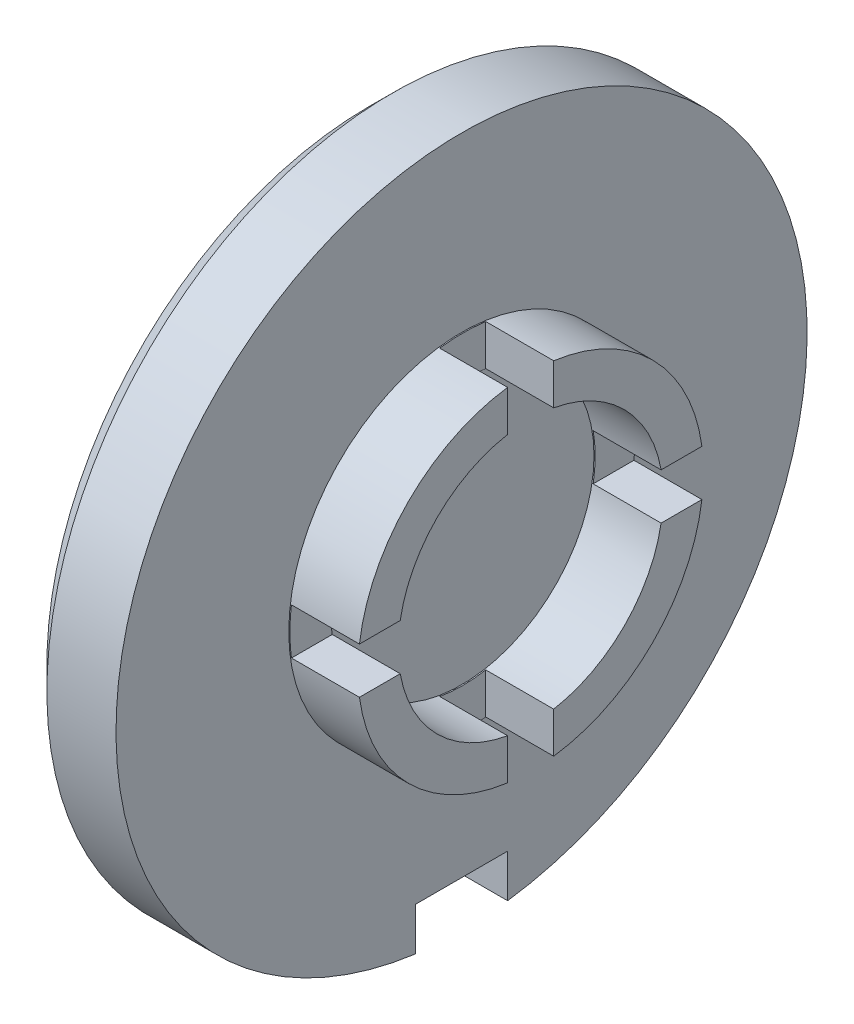
ISO-10303-21;
HEADER;
FILE_DESCRIPTION(('STEP AP214'),'2;1');
FILE_NAME('part.step','',(''),(''),'','','');
FILE_SCHEMA(('AUTOMOTIVE_DESIGN { 1 0 10303 214 1 1 1 1 }'));
ENDSEC;
DATA;
#1=APPLICATION_CONTEXT('core data for automotive mechanical design processes');
#2=APPLICATION_PROTOCOL_DEFINITION('international standard','automotive_design',2000,#1);
#3=PRODUCT_CONTEXT('',#1,'mechanical');
#4=PRODUCT('Part','Part','',(#3));
#5=PRODUCT_RELATED_PRODUCT_CATEGORY('part','',(#4));
#6=PRODUCT_DEFINITION_FORMATION('','',#4);
#7=PRODUCT_DEFINITION_CONTEXT('part definition',#1,'design');
#8=PRODUCT_DEFINITION('design','',#6,#7);
#9=PRODUCT_DEFINITION_SHAPE('','',#8);
#10=(LENGTH_UNIT() NAMED_UNIT(*) SI_UNIT(.MILLI.,.METRE.));
#11=(NAMED_UNIT(*) PLANE_ANGLE_UNIT() SI_UNIT($,.RADIAN.));
#12=(NAMED_UNIT(*) SI_UNIT($,.STERADIAN.) SOLID_ANGLE_UNIT());
#13=UNCERTAINTY_MEASURE_WITH_UNIT(LENGTH_MEASURE(1.E-05),#10,'distance_accuracy_value','');
#14=(GEOMETRIC_REPRESENTATION_CONTEXT(3) GLOBAL_UNCERTAINTY_ASSIGNED_CONTEXT((#13)) GLOBAL_UNIT_ASSIGNED_CONTEXT((#10,
#11,#12)) REPRESENTATION_CONTEXT('',''));
#15=CARTESIAN_POINT('',(0.,0.,0.));
#16=DIRECTION('',(0.,0.,1.));
#17=DIRECTION('',(1.,0.,0.));
#18=AXIS2_PLACEMENT_3D('',#15,#16,#17);
#19=CARTESIAN_POINT('',(-61.,18.,-52.));
#20=DIRECTION('',(1.,0.,0.));
#21=DIRECTION('',(0.,0.,-1.));
#22=AXIS2_PLACEMENT_3D('',#19,#20,#21);
#23=PLANE('',#22);
#24=DIRECTION('',(0.,1.,0.));
#25=VECTOR('',#24,1.);
#26=CARTESIAN_POINT('',(-61.,18.,-51.2));
#27=LINE('',#26,#25);
#28=CARTESIAN_POINT('',(-61.,12.4574374157796,-51.2));
#29=VERTEX_POINT('',#28);
#30=CARTESIAN_POINT('',(-61.,12.8,-51.2));
#31=VERTEX_POINT('',#30);
#32=EDGE_CURVE('E359',#29,#31,#27,.T.);
#33=ORIENTED_EDGE('',*,*,#32,.F.);
#34=CARTESIAN_POINT('',(-61.,18.,-52.));
#35=DIRECTION('',(-1.,0.,0.));
#36=DIRECTION('',(0.,0.,1.));
#37=AXIS2_PLACEMENT_3D('',#34,#35,#36);
#38=CIRCLE('',#37,5.6);
#39=CARTESIAN_POINT('',(-61.,12.4574374157796,-52.8));
#40=VERTEX_POINT('',#39);
#41=EDGE_CURVE('E260',#29,#40,#38,.T.);
#42=ORIENTED_EDGE('',*,*,#41,.T.);
#43=DIRECTION('',(0.,1.,0.));
#44=VECTOR('',#43,1.);
#45=CARTESIAN_POINT('',(-61.,18.,-52.8));
#46=LINE('',#45,#44);
#47=CARTESIAN_POINT('',(-61.,12.8,-52.8));
#48=VERTEX_POINT('',#47);
#49=EDGE_CURVE('E395',#40,#48,#46,.T.);
#50=ORIENTED_EDGE('',*,*,#49,.T.);
#51=DIRECTION('',(0.,0.,-1.));
#52=VECTOR('',#51,1.);
#53=CARTESIAN_POINT('',(-61.,12.8,-52.));
#54=LINE('',#53,#52);
#55=EDGE_CURVE('E205',#31,#48,#54,.T.);
#56=ORIENTED_EDGE('',*,*,#55,.F.);
#57=EDGE_LOOP('',(#33,#42,#50,#56));
#58=FACE_BOUND('',#57,.T.);
#59=ADVANCED_FACE('F47',(#58),#23,.F.);
#60=CARTESIAN_POINT('',(-60.6,18.,-52.));
#61=DIRECTION('',(1.,0.,0.));
#62=DIRECTION('',(0.,0.,-1.));
#63=AXIS2_PLACEMENT_3D('',#60,#61,#62);
#64=CONICAL_SURFACE('',#63,6.,0.785398163397448);
#65=CARTESIAN_POINT('',(-59.7053728090001,11.151943041791,-51.2));
#66=CARTESIAN_POINT('',(-59.8881030317565,11.3359192533132,-51.2));
#67=CARTESIAN_POINT('',(-60.0707866928955,11.5199417495671,-51.2));
#68=CARTESIAN_POINT('',(-60.4360245862569,11.8881147982359,-51.2));
#69=CARTESIAN_POINT('',(-60.6185788185969,12.0722653505341,-51.2));
#70=CARTESIAN_POINT('',(-60.9835219670776,12.4407304192213,-51.2));
#71=CARTESIAN_POINT('',(-61.1659108831408,12.625044935687,-51.2));
#72=CARTESIAN_POINT('',(-61.5304582431577,12.9939020574378,-51.2));
#73=CARTESIAN_POINT('',(-61.7126166868986,13.1784446629332,-51.2));
#74=CARTESIAN_POINT('',(-61.8946271909999,13.3631332484449,-51.2));
#75=B_SPLINE_CURVE_WITH_KNOTS('',3,(#65,#66,#67,#68,#69,#70,#71,#72,#73,#74),.UNSPECIFIED.,.F.,
.F.,(4,2,2,2,4),(0.,0.777906337908816,1.55581196755151,2.33371796179649,3.11162467374071),.UNSPECIFIED.);
#76=CARTESIAN_POINT('',(-60.6,12.0535725010726,-51.2));
#77=VERTEX_POINT('',#76);
#78=EDGE_CURVE('E362',#77,#29,#75,.T.);
#79=ORIENTED_EDGE('',*,*,#78,.F.);
#80=CARTESIAN_POINT('',(-60.6,18.,-52.));
#81=DIRECTION('',(-1.,0.,0.));
#82=DIRECTION('',(0.,0.,1.));
#83=AXIS2_PLACEMENT_3D('',#80,#81,#82);
#84=CIRCLE('',#83,6.);
#85=CARTESIAN_POINT('',(-60.6,12.0535725010726,-52.8));
#86=VERTEX_POINT('',#85);
#87=EDGE_CURVE('E264',#77,#86,#84,.T.);
#88=ORIENTED_EDGE('',*,*,#87,.T.);
#89=CARTESIAN_POINT('',(-59.7053728090001,11.151943041791,-52.8));
#90=CARTESIAN_POINT('',(-59.8881030317565,11.3359192533132,-52.8));
#91=CARTESIAN_POINT('',(-60.0707866928955,11.5199417495671,-52.8));
#92=CARTESIAN_POINT('',(-60.4360245862569,11.8881147982359,-52.8));
#93=CARTESIAN_POINT('',(-60.6185788185969,12.0722653505341,-52.8));
#94=CARTESIAN_POINT('',(-60.9835219670776,12.4407304192213,-52.8));
#95=CARTESIAN_POINT('',(-61.1659108831408,12.625044935687,-52.8));
#96=CARTESIAN_POINT('',(-61.5304582431577,12.9939020574378,-52.8));
#97=CARTESIAN_POINT('',(-61.7126166868986,13.1784446629332,-52.8));
#98=CARTESIAN_POINT('',(-61.8946271909999,13.3631332484449,-52.8));
#99=B_SPLINE_CURVE_WITH_KNOTS('',3,(#89,#90,#91,#92,#93,#94,#95,#96,#97,#98),.UNSPECIFIED.,.F.,
.F.,(4,2,2,2,4),(0.,0.777906337908816,1.55581196755151,2.33371796179649,3.11162467374071),.UNSPECIFIED.);
#100=EDGE_CURVE('E387',#86,#40,#99,.T.);
#101=ORIENTED_EDGE('',*,*,#100,.T.);
#102=ORIENTED_EDGE('',*,*,#41,.F.);
#103=EDGE_LOOP('',(#79,#88,#101,#102));
#104=FACE_BOUND('',#103,.T.);
#105=ADVANCED_FACE('F373',(#104),#64,.T.);
#106=CARTESIAN_POINT('',(-66.,18.,-52.));
#107=DIRECTION('',(-1.,0.,0.));
#108=DIRECTION('',(0.,0.,1.));
#109=AXIS2_PLACEMENT_3D('',#106,#107,#108);
#110=CYLINDRICAL_SURFACE('',#109,6.);
#111=DIRECTION('',(-1.,0.,0.));
#112=VECTOR('',#111,1.);
#113=CARTESIAN_POINT('',(-66.,12.0535725010726,-51.2));
#114=LINE('',#113,#112);
#115=CARTESIAN_POINT('',(-59.4,12.0535725010726,-51.2));
#116=VERTEX_POINT('',#115);
#117=EDGE_CURVE('E371',#116,#77,#114,.T.);
#118=ORIENTED_EDGE('',*,*,#117,.F.);
#119=CARTESIAN_POINT('',(-59.4,18.,-52.));
#120=DIRECTION('',(-1.,0.,0.));
#121=DIRECTION('',(0.,0.,1.));
#122=AXIS2_PLACEMENT_3D('',#119,#120,#121);
#123=CIRCLE('',#122,6.);
#124=CARTESIAN_POINT('',(-59.4,12.0535725010726,-52.8));
#125=VERTEX_POINT('',#124);
#126=EDGE_CURVE('E268',#116,#125,#123,.T.);
#127=ORIENTED_EDGE('',*,*,#126,.T.);
#128=DIRECTION('',(-1.,0.,0.));
#129=VECTOR('',#128,1.);
#130=CARTESIAN_POINT('',(-66.,12.0535725010726,-52.8));
#131=LINE('',#130,#129);
#132=EDGE_CURVE('E63',#125,#86,#131,.T.);
#133=ORIENTED_EDGE('',*,*,#132,.T.);
#134=ORIENTED_EDGE('',*,*,#87,.F.);
#135=EDGE_LOOP('',(#118,#127,#133,#134));
#136=FACE_BOUND('',#135,.T.);
#137=ADVANCED_FACE('F406',(#136),#110,.T.);
#138=CARTESIAN_POINT('',(-59.4,24.,-52.));
#139=DIRECTION('',(-1.,0.,0.));
#140=DIRECTION('',(0.,0.,1.));
#141=AXIS2_PLACEMENT_3D('',#138,#139,#140);
#142=PLANE('',#141);
#143=CARTESIAN_POINT('',(-59.4,18.,-52.));
#144=DIRECTION('',(-1.,0.,0.));
#145=DIRECTION('',(0.,0.,1.));
#146=AXIS2_PLACEMENT_3D('',#143,#144,#145);
#147=CIRCLE('',#146,3.);
#148=CARTESIAN_POINT('',(-59.4,18.,-49.));
#149=VERTEX_POINT('',#148);
#150=EDGE_CURVE('E271',#149,#149,#147,.T.);
#151=ORIENTED_EDGE('',*,*,#150,.T.);
#152=EDGE_LOOP('',(#151));
#153=FACE_BOUND('',#152,.T.);
#154=DIRECTION('',(0.,-1.,0.));
#155=VECTOR('',#154,1.);
#156=CARTESIAN_POINT('',(-59.4,24.,-51.2));
#157=LINE('',#156,#155);
#158=CARTESIAN_POINT('',(-59.4,12.8,-51.2));
#159=VERTEX_POINT('',#158);
#160=EDGE_CURVE('E11',#159,#116,#157,.T.);
#161=ORIENTED_EDGE('',*,*,#160,.F.);
#162=DIRECTION('',(0.,0.,1.));
#163=VECTOR('',#162,1.);
#164=CARTESIAN_POINT('',(-59.4,12.8,-52.));
#165=LINE('',#164,#163);
#166=CARTESIAN_POINT('',(-59.4,12.8,-52.8));
#167=VERTEX_POINT('',#166);
#168=EDGE_CURVE('E56',#167,#159,#165,.T.);
#169=ORIENTED_EDGE('',*,*,#168,.F.);
#170=DIRECTION('',(0.,-1.,0.));
#171=VECTOR('',#170,1.);
#172=CARTESIAN_POINT('',(-59.4,24.,-52.8));
#173=LINE('',#172,#171);
#174=EDGE_CURVE('E188',#167,#125,#173,.T.);
#175=ORIENTED_EDGE('',*,*,#174,.T.);
#176=ORIENTED_EDGE('',*,*,#126,.F.);
#177=EDGE_LOOP('',(#161,#169,#175,#176));
#178=FACE_BOUND('',#177,.T.);
#179=ADVANCED_FACE('F210',(#153,#178),#142,.F.);
#180=CARTESIAN_POINT('',(-58.2,21.,-52.));
#181=DIRECTION('',(-1.,0.,0.));
#182=DIRECTION('',(0.,0.,1.));
#183=AXIS2_PLACEMENT_3D('',#180,#181,#182);
#184=PLANE('',#183);
#185=DIRECTION('',(0.,-1.,0.));
#186=VECTOR('',#185,1.);
#187=CARTESIAN_POINT('',(-58.2,21.,-51.6));
#188=LINE('',#187,#186);
#189=CARTESIAN_POINT('',(-58.2,15.7350496694188,-51.6));
#190=VERTEX_POINT('',#189);
#191=CARTESIAN_POINT('',(-58.2,15.0267862505363,-51.6));
#192=VERTEX_POINT('',#191);
#193=EDGE_CURVE('E324',#190,#192,#188,.T.);
#194=ORIENTED_EDGE('',*,*,#193,.F.);
#195=CARTESIAN_POINT('',(-58.2,18.,-52.));
#196=DIRECTION('',(-1.,0.,0.));
#197=DIRECTION('',(0.,0.,1.));
#198=AXIS2_PLACEMENT_3D('',#195,#196,#197);
#199=CIRCLE('',#198,2.3);
#200=CARTESIAN_POINT('',(-58.2,17.6,-49.7350496694188));
#201=VERTEX_POINT('',#200);
#202=EDGE_CURVE('E259',#190,#201,#199,.T.);
#203=ORIENTED_EDGE('',*,*,#202,.T.);
#204=DIRECTION('',(0.,0.,-1.));
#205=VECTOR('',#204,1.);
#206=CARTESIAN_POINT('',(-58.2,17.6,-52.));
#207=LINE('',#206,#205);
#208=CARTESIAN_POINT('',(-58.2,17.6,-49.0267862505363));
#209=VERTEX_POINT('',#208);
#210=EDGE_CURVE('E293',#209,#201,#207,.T.);
#211=ORIENTED_EDGE('',*,*,#210,.F.);
#212=CARTESIAN_POINT('',(-58.2,18.,-52.));
#213=DIRECTION('',(-1.,0.,0.));
#214=DIRECTION('',(0.,0.,1.));
#215=AXIS2_PLACEMENT_3D('',#212,#213,#214);
#216=CIRCLE('',#215,3.);
#217=EDGE_CURVE('E280',#192,#209,#216,.T.);
#218=ORIENTED_EDGE('',*,*,#217,.F.);
#219=EDGE_LOOP('',(#194,#203,#211,#218));
#220=FACE_BOUND('',#219,.T.);
#221=ADVANCED_FACE('F431',(#220),#184,.F.);
#222=DIRECTION('',(0.,-1.,0.));
#223=VECTOR('',#222,1.);
#224=CARTESIAN_POINT('',(-58.2,21.,-51.6));
#225=LINE('',#224,#223);
#226=CARTESIAN_POINT('',(-58.2,20.9732137494637,-51.6));
#227=VERTEX_POINT('',#226);
#228=CARTESIAN_POINT('',(-58.2,20.2649503305812,-51.6));
#229=VERTEX_POINT('',#228);
#230=EDGE_CURVE('E330',#227,#229,#225,.T.);
#231=ORIENTED_EDGE('',*,*,#230,.F.);
#232=CARTESIAN_POINT('',(-58.2,18.4,-49.0267862505363));
#233=VERTEX_POINT('',#232);
#234=EDGE_CURVE('E275',#233,#227,#216,.T.);
#235=ORIENTED_EDGE('',*,*,#234,.F.);
#236=DIRECTION('',(0.,0.,1.));
#237=VECTOR('',#236,1.);
#238=CARTESIAN_POINT('',(-58.2,18.4,-52.));
#239=LINE('',#238,#237);
#240=CARTESIAN_POINT('',(-58.2,18.4,-49.7350496694188));
#241=VERTEX_POINT('',#240);
#242=EDGE_CURVE('E300',#241,#233,#239,.T.);
#243=ORIENTED_EDGE('',*,*,#242,.F.);
#244=EDGE_CURVE('E249',#241,#229,#199,.T.);
#245=ORIENTED_EDGE('',*,*,#244,.T.);
#246=EDGE_LOOP('',(#231,#235,#243,#245));
#247=FACE_BOUND('',#246,.T.);
#248=ADVANCED_FACE('F423',(#247),#184,.F.);
#249=CARTESIAN_POINT('',(-66.,18.,-52.));
#250=DIRECTION('',(-1.,0.,0.));
#251=DIRECTION('',(0.,0.,1.));
#252=AXIS2_PLACEMENT_3D('',#249,#250,#251);
#253=CYLINDRICAL_SURFACE('',#252,2.3);
#254=CARTESIAN_POINT('',(-59.4,18.,-52.));
#255=DIRECTION('',(-1.,0.,0.));
#256=DIRECTION('',(0.,0.,1.));
#257=AXIS2_PLACEMENT_3D('',#254,#255,#256);
#258=CIRCLE('',#257,2.3);
#259=CARTESIAN_POINT('',(-59.4,18.,-49.7));
#260=VERTEX_POINT('',#259);
#261=EDGE_CURVE('E255',#260,#260,#258,.T.);
#262=ORIENTED_EDGE('',*,*,#261,.T.);
#263=EDGE_LOOP('',(#262));
#264=FACE_BOUND('',#263,.T.);
#265=DIRECTION('',(-1.,0.,0.));
#266=VECTOR('',#265,1.);
#267=CARTESIAN_POINT('',(-66.,15.7350496694188,-51.6));
#268=LINE('',#267,#266);
#269=CARTESIAN_POINT('',(-59.38,15.7350496694188,-51.6));
#270=VERTEX_POINT('',#269);
#271=EDGE_CURVE('E321',#270,#190,#268,.F.);
#272=ORIENTED_EDGE('',*,*,#271,.F.);
#273=CARTESIAN_POINT('',(-59.38,18.,-52.));
#274=DIRECTION('',(1.,0.,0.));
#275=DIRECTION('',(0.,0.,-1.));
#276=AXIS2_PLACEMENT_3D('',#273,#274,#275);
#277=CIRCLE('',#276,2.3);
#278=CARTESIAN_POINT('',(-59.38,15.7350496694188,-52.4));
#279=VERTEX_POINT('',#278);
#280=EDGE_CURVE('E317',#279,#270,#277,.F.);
#281=ORIENTED_EDGE('',*,*,#280,.F.);
#282=DIRECTION('',(-1.,0.,0.));
#283=VECTOR('',#282,1.);
#284=CARTESIAN_POINT('',(-66.,15.7350496694188,-52.4));
#285=LINE('',#284,#283);
#286=CARTESIAN_POINT('',(-58.2,15.7350496694188,-52.4));
#287=VERTEX_POINT('',#286);
#288=EDGE_CURVE('E333',#279,#287,#285,.F.);
#289=ORIENTED_EDGE('',*,*,#288,.T.);
#290=CARTESIAN_POINT('',(-58.2,17.6,-54.2649503305812));
#291=VERTEX_POINT('',#290);
#292=EDGE_CURVE('E254',#291,#287,#199,.T.);
#293=ORIENTED_EDGE('',*,*,#292,.F.);
#294=DIRECTION('',(-1.,0.,0.));
#295=VECTOR('',#294,1.);
#296=CARTESIAN_POINT('',(-66.,17.6,-54.2649503305812));
#297=LINE('',#296,#295);
#298=CARTESIAN_POINT('',(-59.38,17.6,-54.2649503305812));
#299=VERTEX_POINT('',#298);
#300=EDGE_CURVE('E286',#299,#291,#297,.F.);
#301=ORIENTED_EDGE('',*,*,#300,.F.);
#302=CARTESIAN_POINT('',(-59.38,18.,-52.));
#303=DIRECTION('',(1.,0.,0.));
#304=DIRECTION('',(0.,0.,-1.));
#305=AXIS2_PLACEMENT_3D('',#302,#303,#304);
#306=CIRCLE('',#305,2.3);
#307=CARTESIAN_POINT('',(-59.38,18.4,-54.2649503305812));
#308=VERTEX_POINT('',#307);
#309=EDGE_CURVE('E282',#308,#299,#306,.F.);
#310=ORIENTED_EDGE('',*,*,#309,.F.);
#311=DIRECTION('',(-1.,0.,0.));
#312=VECTOR('',#311,1.);
#313=CARTESIAN_POINT('',(-66.,18.4,-54.2649503305812));
#314=LINE('',#313,#312);
#315=CARTESIAN_POINT('',(-58.2,18.4,-54.2649503305812));
#316=VERTEX_POINT('',#315);
#317=EDGE_CURVE('E301',#316,#308,#314,.T.);
#318=ORIENTED_EDGE('',*,*,#317,.F.);
#319=CARTESIAN_POINT('',(-58.2,20.2649503305812,-52.4));
#320=VERTEX_POINT('',#319);
#321=EDGE_CURVE('E253',#320,#316,#199,.T.);
#322=ORIENTED_EDGE('',*,*,#321,.F.);
#323=DIRECTION('',(-1.,0.,0.));
#324=VECTOR('',#323,1.);
#325=CARTESIAN_POINT('',(-66.,20.2649503305812,-52.4));
#326=LINE('',#325,#324);
#327=CARTESIAN_POINT('',(-59.38,20.2649503305812,-52.4));
#328=VERTEX_POINT('',#327);
#329=EDGE_CURVE('E341',#320,#328,#326,.T.);
#330=ORIENTED_EDGE('',*,*,#329,.T.);
#331=CARTESIAN_POINT('',(-59.38,20.2649503305812,-51.6));
#332=VERTEX_POINT('',#331);
#333=EDGE_CURVE('E318',#332,#328,#277,.F.);
#334=ORIENTED_EDGE('',*,*,#333,.F.);
#335=DIRECTION('',(-1.,0.,0.));
#336=VECTOR('',#335,1.);
#337=CARTESIAN_POINT('',(-66.,20.2649503305812,-51.6));
#338=LINE('',#337,#336);
#339=EDGE_CURVE('E327',#229,#332,#338,.T.);
#340=ORIENTED_EDGE('',*,*,#339,.F.);
#341=ORIENTED_EDGE('',*,*,#244,.F.);
#342=DIRECTION('',(-1.,0.,0.));
#343=VECTOR('',#342,1.);
#344=CARTESIAN_POINT('',(-66.,18.4,-49.7350496694188));
#345=LINE('',#344,#343);
#346=CARTESIAN_POINT('',(-59.38,18.4,-49.7350496694188));
#347=VERTEX_POINT('',#346);
#348=EDGE_CURVE('E297',#347,#241,#345,.F.);
#349=ORIENTED_EDGE('',*,*,#348,.F.);
#350=CARTESIAN_POINT('',(-59.38,17.6,-49.7350496694188));
#351=VERTEX_POINT('',#350);
#352=EDGE_CURVE('E285',#351,#347,#306,.F.);
#353=ORIENTED_EDGE('',*,*,#352,.F.);
#354=DIRECTION('',(-1.,0.,0.));
#355=VECTOR('',#354,1.);
#356=CARTESIAN_POINT('',(-66.,17.6,-49.7350496694188));
#357=LINE('',#356,#355);
#358=EDGE_CURVE('E290',#201,#351,#357,.T.);
#359=ORIENTED_EDGE('',*,*,#358,.F.);
#360=ORIENTED_EDGE('',*,*,#202,.F.);
#361=EDGE_LOOP('',(#272,#281,#289,#293,#301,#310,#318,#322,#330,#334,#340,#341,#349,#353,#359,#360));
#362=FACE_BOUND('',#361,.T.);
#363=ADVANCED_FACE('F420',(#264,#362),#253,.F.);
#364=CARTESIAN_POINT('',(-66.,18.,-52.));
#365=DIRECTION('',(-1.,0.,0.));
#366=DIRECTION('',(0.,0.,1.));
#367=AXIS2_PLACEMENT_3D('',#364,#365,#366);
#368=CYLINDRICAL_SURFACE('',#367,3.);
#369=ORIENTED_EDGE('',*,*,#150,.F.);
#370=EDGE_LOOP('',(#369));
#371=FACE_BOUND('',#370,.T.);
#372=DIRECTION('',(-1.,0.,0.));
#373=VECTOR('',#372,1.);
#374=CARTESIAN_POINT('',(-66.,15.0267862505363,-51.6));
#375=LINE('',#374,#373);
#376=CARTESIAN_POINT('',(-59.38,15.0267862505363,-51.6));
#377=VERTEX_POINT('',#376);
#378=EDGE_CURVE('E198',#192,#377,#375,.T.);
#379=ORIENTED_EDGE('',*,*,#378,.F.);
#380=ORIENTED_EDGE('',*,*,#217,.T.);
#381=DIRECTION('',(-1.,0.,0.));
#382=VECTOR('',#381,1.);
#383=CARTESIAN_POINT('',(-66.,17.6,-49.0267862505363));
#384=LINE('',#383,#382);
#385=CARTESIAN_POINT('',(-59.38,17.6,-49.0267862505363));
#386=VERTEX_POINT('',#385);
#387=EDGE_CURVE('E230',#386,#209,#384,.F.);
#388=ORIENTED_EDGE('',*,*,#387,.F.);
#389=CARTESIAN_POINT('',(-59.38,18.,-52.));
#390=DIRECTION('',(1.,0.,0.));
#391=DIRECTION('',(0.,0.,-1.));
#392=AXIS2_PLACEMENT_3D('',#389,#390,#391);
#393=CIRCLE('',#392,3.);
#394=CARTESIAN_POINT('',(-59.38,18.4,-49.0267862505363));
#395=VERTEX_POINT('',#394);
#396=EDGE_CURVE('E234',#395,#386,#393,.T.);
#397=ORIENTED_EDGE('',*,*,#396,.F.);
#398=DIRECTION('',(-1.,0.,0.));
#399=VECTOR('',#398,1.);
#400=CARTESIAN_POINT('',(-66.,18.4,-49.0267862505363));
#401=LINE('',#400,#399);
#402=EDGE_CURVE('E235',#233,#395,#401,.T.);
#403=ORIENTED_EDGE('',*,*,#402,.F.);
#404=ORIENTED_EDGE('',*,*,#234,.T.);
#405=DIRECTION('',(-1.,0.,0.));
#406=VECTOR('',#405,1.);
#407=CARTESIAN_POINT('',(-66.,20.9732137494637,-51.6));
#408=LINE('',#407,#406);
#409=CARTESIAN_POINT('',(-59.38,20.9732137494637,-51.6));
#410=VERTEX_POINT('',#409);
#411=EDGE_CURVE('E220',#410,#227,#408,.F.);
#412=ORIENTED_EDGE('',*,*,#411,.F.);
#413=CARTESIAN_POINT('',(-59.38,18.,-52.));
#414=DIRECTION('',(1.,0.,0.));
#415=DIRECTION('',(0.,0.,-1.));
#416=AXIS2_PLACEMENT_3D('',#413,#414,#415);
#417=CIRCLE('',#416,3.);
#418=CARTESIAN_POINT('',(-59.38,20.9732137494637,-52.4));
#419=VERTEX_POINT('',#418);
#420=EDGE_CURVE('E223',#419,#410,#417,.T.);
#421=ORIENTED_EDGE('',*,*,#420,.F.);
#422=DIRECTION('',(-1.,0.,0.));
#423=VECTOR('',#422,1.);
#424=CARTESIAN_POINT('',(-66.,20.9732137494637,-52.4));
#425=LINE('',#424,#423);
#426=CARTESIAN_POINT('',(-58.2,20.9732137494637,-52.4));
#427=VERTEX_POINT('',#426);
#428=EDGE_CURVE('E226',#419,#427,#425,.F.);
#429=ORIENTED_EDGE('',*,*,#428,.T.);
#430=CARTESIAN_POINT('',(-58.2,18.4,-54.9732137494637));
#431=VERTEX_POINT('',#430);
#432=EDGE_CURVE('E279',#427,#431,#216,.T.);
#433=ORIENTED_EDGE('',*,*,#432,.T.);
#434=DIRECTION('',(-1.,0.,0.));
#435=VECTOR('',#434,1.);
#436=CARTESIAN_POINT('',(-66.,18.4,-54.9732137494637));
#437=LINE('',#436,#435);
#438=CARTESIAN_POINT('',(-59.38,18.4,-54.9732137494637));
#439=VERTEX_POINT('',#438);
#440=EDGE_CURVE('E245',#439,#431,#437,.F.);
#441=ORIENTED_EDGE('',*,*,#440,.F.);
#442=CARTESIAN_POINT('',(-59.38,17.6,-54.9732137494637));
#443=VERTEX_POINT('',#442);
#444=EDGE_CURVE('E241',#443,#439,#393,.T.);
#445=ORIENTED_EDGE('',*,*,#444,.F.);
#446=DIRECTION('',(-1.,0.,0.));
#447=VECTOR('',#446,1.);
#448=CARTESIAN_POINT('',(-66.,17.6,-54.9732137494637));
#449=LINE('',#448,#447);
#450=CARTESIAN_POINT('',(-58.2,17.6,-54.9732137494637));
#451=VERTEX_POINT('',#450);
#452=EDGE_CURVE('E238',#451,#443,#449,.T.);
#453=ORIENTED_EDGE('',*,*,#452,.F.);
#454=CARTESIAN_POINT('',(-58.2,15.0267862505363,-52.4));
#455=VERTEX_POINT('',#454);
#456=EDGE_CURVE('E281',#451,#455,#216,.T.);
#457=ORIENTED_EDGE('',*,*,#456,.T.);
#458=DIRECTION('',(-1.,0.,0.));
#459=VECTOR('',#458,1.);
#460=CARTESIAN_POINT('',(-66.,15.0267862505363,-52.4));
#461=LINE('',#460,#459);
#462=CARTESIAN_POINT('',(-59.38,15.0267862505363,-52.4));
#463=VERTEX_POINT('',#462);
#464=EDGE_CURVE('E216',#455,#463,#461,.T.);
#465=ORIENTED_EDGE('',*,*,#464,.T.);
#466=EDGE_CURVE('E215',#377,#463,#417,.T.);
#467=ORIENTED_EDGE('',*,*,#466,.F.);
#468=EDGE_LOOP('',(#379,#380,#388,#397,#403,#404,#412,#421,#429,#433,#441,#445,#453,#457,#465,#467));
#469=FACE_BOUND('',#468,.T.);
#470=ADVANCED_FACE('F422',(#371,#469),#368,.T.);
#471=ORIENTED_EDGE('',*,*,#292,.T.);
#472=DIRECTION('',(0.,-1.,0.));
#473=VECTOR('',#472,1.);
#474=CARTESIAN_POINT('',(-58.2,21.,-52.4));
#475=LINE('',#474,#473);
#476=EDGE_CURVE('E337',#287,#455,#475,.T.);
#477=ORIENTED_EDGE('',*,*,#476,.T.);
#478=ORIENTED_EDGE('',*,*,#456,.F.);
#479=EDGE_CURVE('E289',#291,#451,#207,.T.);
#480=ORIENTED_EDGE('',*,*,#479,.F.);
#481=EDGE_LOOP('',(#471,#477,#478,#480));
#482=FACE_BOUND('',#481,.T.);
#483=ADVANCED_FACE('F49',(#482),#184,.F.);
#484=ORIENTED_EDGE('',*,*,#432,.F.);
#485=DIRECTION('',(0.,-1.,0.));
#486=VECTOR('',#485,1.);
#487=CARTESIAN_POINT('',(-58.2,21.,-52.4));
#488=LINE('',#487,#486);
#489=EDGE_CURVE('E345',#427,#320,#488,.T.);
#490=ORIENTED_EDGE('',*,*,#489,.T.);
#491=ORIENTED_EDGE('',*,*,#321,.T.);
#492=EDGE_CURVE('E304',#431,#316,#239,.T.);
#493=ORIENTED_EDGE('',*,*,#492,.F.);
#494=EDGE_LOOP('',(#484,#490,#491,#493));
#495=FACE_BOUND('',#494,.T.);
#496=ADVANCED_FACE('F418',(#495),#184,.F.);
#497=CARTESIAN_POINT('',(-59.4,20.3,-52.));
#498=DIRECTION('',(-1.,0.,0.));
#499=DIRECTION('',(0.,0.,1.));
#500=AXIS2_PLACEMENT_3D('',#497,#498,#499);
#501=PLANE('',#500);
#502=ORIENTED_EDGE('',*,*,#261,.F.);
#503=EDGE_LOOP('',(#502));
#504=FACE_BOUND('',#503,.T.);
#505=ADVANCED_FACE('F415',(#504),#501,.F.);
#506=CARTESIAN_POINT('',(-59.38,17.6,-48.8));
#507=DIRECTION('',(0.,1.,0.));
#508=DIRECTION('',(0.,0.,1.));
#509=AXIS2_PLACEMENT_3D('',#506,#507,#508);
#510=PLANE('',#509);
#511=ORIENTED_EDGE('',*,*,#300,.T.);
#512=ORIENTED_EDGE('',*,*,#479,.T.);
#513=ORIENTED_EDGE('',*,*,#452,.T.);
#514=DIRECTION('',(0.,0.,-1.));
#515=VECTOR('',#514,1.);
#516=CARTESIAN_POINT('',(-59.38,17.6,-48.8));
#517=LINE('',#516,#515);
#518=EDGE_CURVE('E309',#299,#443,#517,.T.);
#519=ORIENTED_EDGE('',*,*,#518,.F.);
#520=EDGE_LOOP('',(#511,#512,#513,#519));
#521=FACE_BOUND('',#520,.T.);
#522=ADVANCED_FACE('F417',(#521),#510,.T.);
#523=CARTESIAN_POINT('',(-59.38,18.4,-48.8));
#524=DIRECTION('',(0.,-1.,0.));
#525=DIRECTION('',(0.,0.,-1.));
#526=AXIS2_PLACEMENT_3D('',#523,#524,#525);
#527=PLANE('',#526);
#528=ORIENTED_EDGE('',*,*,#317,.T.);
#529=DIRECTION('',(0.,0.,-1.));
#530=VECTOR('',#529,1.);
#531=CARTESIAN_POINT('',(-59.38,18.4,-48.8));
#532=LINE('',#531,#530);
#533=EDGE_CURVE('E314',#308,#439,#532,.T.);
#534=ORIENTED_EDGE('',*,*,#533,.T.);
#535=ORIENTED_EDGE('',*,*,#440,.T.);
#536=ORIENTED_EDGE('',*,*,#492,.T.);
#537=EDGE_LOOP('',(#528,#534,#535,#536));
#538=FACE_BOUND('',#537,.T.);
#539=ADVANCED_FACE('F461',(#538),#527,.T.);
#540=CARTESIAN_POINT('',(-59.38,17.6,-48.8));
#541=DIRECTION('',(1.,0.,0.));
#542=DIRECTION('',(0.,0.,-1.));
#543=AXIS2_PLACEMENT_3D('',#540,#541,#542);
#544=PLANE('',#543);
#545=ORIENTED_EDGE('',*,*,#309,.T.);
#546=ORIENTED_EDGE('',*,*,#518,.T.);
#547=ORIENTED_EDGE('',*,*,#444,.T.);
#548=ORIENTED_EDGE('',*,*,#533,.F.);
#549=EDGE_LOOP('',(#545,#546,#547,#548));
#550=FACE_BOUND('',#549,.T.);
#551=ADVANCED_FACE('F484',(#550),#544,.T.);
#552=ORIENTED_EDGE('',*,*,#352,.T.);
#553=EDGE_CURVE('E313',#395,#347,#532,.T.);
#554=ORIENTED_EDGE('',*,*,#553,.F.);
#555=ORIENTED_EDGE('',*,*,#396,.T.);
#556=EDGE_CURVE('E308',#386,#351,#517,.T.);
#557=ORIENTED_EDGE('',*,*,#556,.T.);
#558=EDGE_LOOP('',(#552,#554,#555,#557));
#559=FACE_BOUND('',#558,.T.);
#560=ADVANCED_FACE('F486',(#559),#544,.T.);
#561=ORIENTED_EDGE('',*,*,#358,.T.);
#562=ORIENTED_EDGE('',*,*,#556,.F.);
#563=ORIENTED_EDGE('',*,*,#387,.T.);
#564=ORIENTED_EDGE('',*,*,#210,.T.);
#565=EDGE_LOOP('',(#561,#562,#563,#564));
#566=FACE_BOUND('',#565,.T.);
#567=ADVANCED_FACE('F491',(#566),#510,.T.);
#568=ORIENTED_EDGE('',*,*,#348,.T.);
#569=ORIENTED_EDGE('',*,*,#242,.T.);
#570=ORIENTED_EDGE('',*,*,#402,.T.);
#571=ORIENTED_EDGE('',*,*,#553,.T.);
#572=EDGE_LOOP('',(#568,#569,#570,#571));
#573=FACE_BOUND('',#572,.T.);
#574=ADVANCED_FACE('F495',(#573),#527,.T.);
#575=CARTESIAN_POINT('',(0.,0.,-52.4));
#576=DIRECTION('',(0.,0.,-1.));
#577=DIRECTION('',(-1.,0.,0.));
#578=AXIS2_PLACEMENT_3D('',#575,#576,#577);
#579=PLANE('',#578);
#580=ORIENTED_EDGE('',*,*,#489,.F.);
#581=ORIENTED_EDGE('',*,*,#428,.F.);
#582=DIRECTION('',(0.,-1.,0.));
#583=VECTOR('',#582,1.);
#584=CARTESIAN_POINT('',(-59.38,14.8,-52.4));
#585=LINE('',#584,#583);
#586=EDGE_CURVE('E352',#419,#328,#585,.T.);
#587=ORIENTED_EDGE('',*,*,#586,.T.);
#588=ORIENTED_EDGE('',*,*,#329,.F.);
#589=EDGE_LOOP('',(#580,#581,#587,#588));
#590=FACE_BOUND('',#589,.T.);
#591=ADVANCED_FACE('F573',(#590),#579,.F.);
#592=CARTESIAN_POINT('',(0.,0.,-51.6));
#593=DIRECTION('',(0.,0.,-1.));
#594=DIRECTION('',(-1.,0.,0.));
#595=AXIS2_PLACEMENT_3D('',#592,#593,#594);
#596=PLANE('',#595);
#597=ORIENTED_EDGE('',*,*,#339,.T.);
#598=DIRECTION('',(0.,-1.,0.));
#599=VECTOR('',#598,1.);
#600=CARTESIAN_POINT('',(-59.38,14.8,-51.6));
#601=LINE('',#600,#599);
#602=EDGE_CURVE('E349',#410,#332,#601,.T.);
#603=ORIENTED_EDGE('',*,*,#602,.F.);
#604=ORIENTED_EDGE('',*,*,#411,.T.);
#605=ORIENTED_EDGE('',*,*,#230,.T.);
#606=EDGE_LOOP('',(#597,#603,#604,#605));
#607=FACE_BOUND('',#606,.T.);
#608=ADVANCED_FACE('F591',(#607),#596,.T.);
#609=CARTESIAN_POINT('',(-59.38,14.8,-51.6));
#610=DIRECTION('',(1.,0.,0.));
#611=DIRECTION('',(0.,0.,-1.));
#612=AXIS2_PLACEMENT_3D('',#609,#610,#611);
#613=PLANE('',#612);
#614=ORIENTED_EDGE('',*,*,#333,.T.);
#615=ORIENTED_EDGE('',*,*,#586,.F.);
#616=ORIENTED_EDGE('',*,*,#420,.T.);
#617=ORIENTED_EDGE('',*,*,#602,.T.);
#618=EDGE_LOOP('',(#614,#615,#616,#617));
#619=FACE_BOUND('',#618,.T.);
#620=ADVANCED_FACE('F600',(#619),#613,.T.);
#621=ORIENTED_EDGE('',*,*,#280,.T.);
#622=EDGE_CURVE('E353',#270,#377,#601,.T.);
#623=ORIENTED_EDGE('',*,*,#622,.T.);
#624=ORIENTED_EDGE('',*,*,#466,.T.);
#625=EDGE_CURVE('E71',#279,#463,#585,.T.);
#626=ORIENTED_EDGE('',*,*,#625,.F.);
#627=EDGE_LOOP('',(#621,#623,#624,#626));
#628=FACE_BOUND('',#627,.T.);
#629=ADVANCED_FACE('F477',(#628),#613,.T.);
#630=ORIENTED_EDGE('',*,*,#271,.T.);
#631=ORIENTED_EDGE('',*,*,#193,.T.);
#632=ORIENTED_EDGE('',*,*,#378,.T.);
#633=ORIENTED_EDGE('',*,*,#622,.F.);
#634=EDGE_LOOP('',(#630,#631,#632,#633));
#635=FACE_BOUND('',#634,.T.);
#636=ADVANCED_FACE('F442',(#635),#596,.T.);
#637=ORIENTED_EDGE('',*,*,#625,.T.);
#638=ORIENTED_EDGE('',*,*,#464,.F.);
#639=ORIENTED_EDGE('',*,*,#476,.F.);
#640=ORIENTED_EDGE('',*,*,#288,.F.);
#641=EDGE_LOOP('',(#637,#638,#639,#640));
#642=FACE_BOUND('',#641,.T.);
#643=ADVANCED_FACE('F475',(#642),#579,.F.);
#644=CARTESIAN_POINT('',(-61.1,12.8,-51.2));
#645=DIRECTION('',(0.,-1.,0.));
#646=DIRECTION('',(0.,0.,-1.));
#647=AXIS2_PLACEMENT_3D('',#644,#645,#646);
#648=PLANE('',#647);
#649=ORIENTED_EDGE('',*,*,#55,.T.);
#650=DIRECTION('',(-1.,0.,0.));
#651=VECTOR('',#650,1.);
#652=CARTESIAN_POINT('',(-61.1,12.8,-52.8));
#653=LINE('',#652,#651);
#654=EDGE_CURVE('E191',#167,#48,#653,.T.);
#655=ORIENTED_EDGE('',*,*,#654,.F.);
#656=ORIENTED_EDGE('',*,*,#168,.T.);
#657=DIRECTION('',(-1.,0.,0.));
#658=VECTOR('',#657,1.);
#659=CARTESIAN_POINT('',(-61.1,12.8,-51.2));
#660=LINE('',#659,#658);
#661=EDGE_CURVE('E207',#159,#31,#660,.T.);
#662=ORIENTED_EDGE('',*,*,#661,.T.);
#663=EDGE_LOOP('',(#649,#655,#656,#662));
#664=FACE_BOUND('',#663,.T.);
#665=ADVANCED_FACE('F201',(#664),#648,.T.);
#666=CARTESIAN_POINT('',(0.,0.,-51.2));
#667=DIRECTION('',(0.,0.,-1.));
#668=DIRECTION('',(-1.,0.,0.));
#669=AXIS2_PLACEMENT_3D('',#666,#667,#668);
#670=PLANE('',#669);
#671=ORIENTED_EDGE('',*,*,#32,.T.);
#672=ORIENTED_EDGE('',*,*,#661,.F.);
#673=ORIENTED_EDGE('',*,*,#160,.T.);
#674=ORIENTED_EDGE('',*,*,#117,.T.);
#675=ORIENTED_EDGE('',*,*,#78,.T.);
#676=EDGE_LOOP('',(#671,#672,#673,#674,#675));
#677=FACE_BOUND('',#676,.T.);
#678=ADVANCED_FACE('F377',(#677),#670,.T.);
#679=CARTESIAN_POINT('',(0.,0.,-52.8));
#680=DIRECTION('',(0.,0.,-1.));
#681=DIRECTION('',(-1.,0.,0.));
#682=AXIS2_PLACEMENT_3D('',#679,#680,#681);
#683=PLANE('',#682);
#684=ORIENTED_EDGE('',*,*,#100,.F.);
#685=ORIENTED_EDGE('',*,*,#132,.F.);
#686=ORIENTED_EDGE('',*,*,#174,.F.);
#687=ORIENTED_EDGE('',*,*,#654,.T.);
#688=ORIENTED_EDGE('',*,*,#49,.F.);
#689=EDGE_LOOP('',(#684,#685,#686,#687,#688));
#690=FACE_BOUND('',#689,.T.);
#691=ADVANCED_FACE('F190',(#690),#683,.F.);
#692=CLOSED_SHELL('',(#59,#105,#137,#179,#221,#248,#363,#470,#483,#496,#505,#522,#539,#551,#560,
#567,#574,#591,#608,#620,#629,#636,#643,#665,#678,#691));
#693=MANIFOLD_SOLID_BREP('B2',#692);
#694=ADVANCED_BREP_SHAPE_REPRESENTATION('',(#18,#693),#14);
#695=SHAPE_DEFINITION_REPRESENTATION(#9,#694);
ENDSEC;
END-ISO-10303-21;
